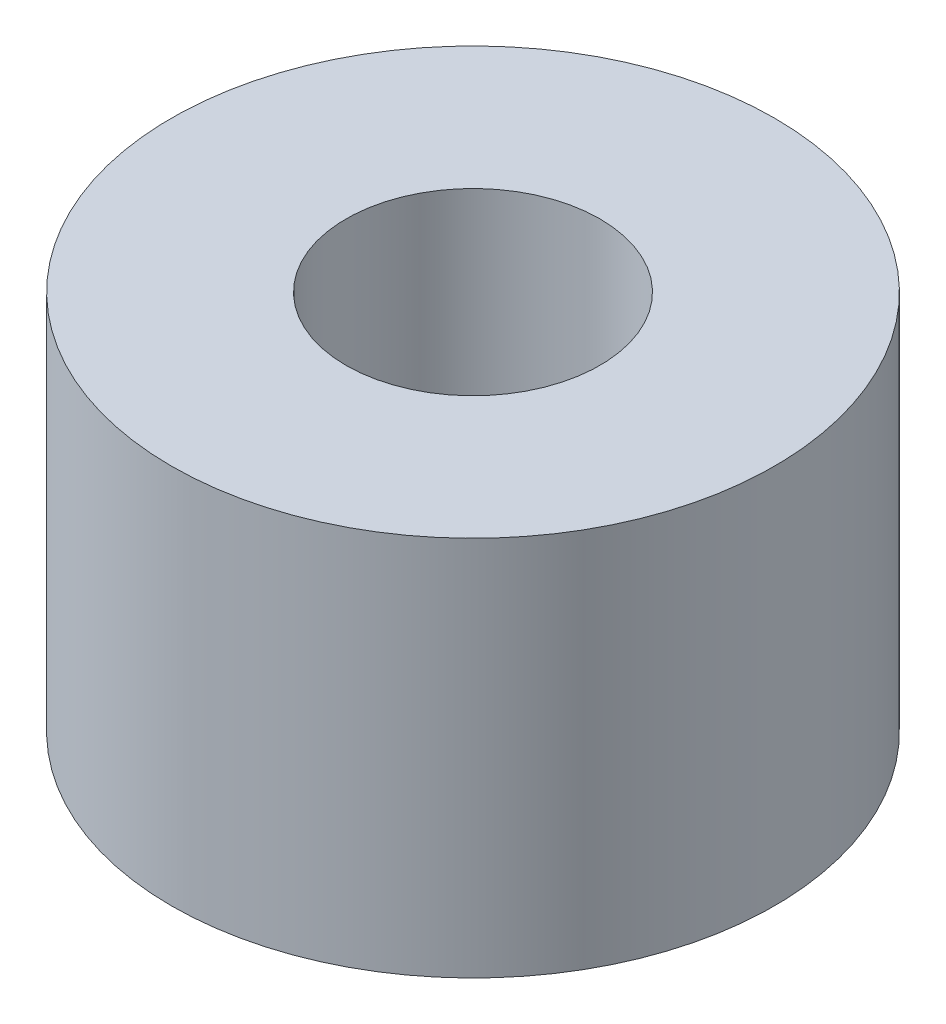
ISO-10303-21;
HEADER;
FILE_DESCRIPTION(('STEP AP214'),'2;1');
FILE_NAME('part.step','',(''),(''),'','','');
FILE_SCHEMA(('AUTOMOTIVE_DESIGN { 1 0 10303 214 1 1 1 1 }'));
ENDSEC;
DATA;
#1=APPLICATION_CONTEXT('core data for automotive mechanical design processes');
#2=APPLICATION_PROTOCOL_DEFINITION('international standard','automotive_design',2000,#1);
#3=PRODUCT_CONTEXT('',#1,'mechanical');
#4=PRODUCT('Part','Part','',(#3));
#5=PRODUCT_RELATED_PRODUCT_CATEGORY('part','',(#4));
#6=PRODUCT_DEFINITION_FORMATION('','',#4);
#7=PRODUCT_DEFINITION_CONTEXT('part definition',#1,'design');
#8=PRODUCT_DEFINITION('design','',#6,#7);
#9=PRODUCT_DEFINITION_SHAPE('','',#8);
#10=(LENGTH_UNIT() NAMED_UNIT(*) SI_UNIT(.MILLI.,.METRE.));
#11=(NAMED_UNIT(*) PLANE_ANGLE_UNIT() SI_UNIT($,.RADIAN.));
#12=(NAMED_UNIT(*) SI_UNIT($,.STERADIAN.) SOLID_ANGLE_UNIT());
#13=UNCERTAINTY_MEASURE_WITH_UNIT(LENGTH_MEASURE(1.E-05),#10,'distance_accuracy_value','');
#14=(GEOMETRIC_REPRESENTATION_CONTEXT(3) GLOBAL_UNCERTAINTY_ASSIGNED_CONTEXT((#13)) GLOBAL_UNIT_ASSIGNED_CONTEXT((#10,
#11,#12)) REPRESENTATION_CONTEXT('',''));
#15=CARTESIAN_POINT('',(0.,0.,0.));
#16=DIRECTION('',(0.,0.,1.));
#17=DIRECTION('',(1.,0.,0.));
#18=AXIS2_PLACEMENT_3D('',#15,#16,#17);
#19=CARTESIAN_POINT('',(0.,12.,0.));
#20=DIRECTION('',(0.,1.,0.));
#21=DIRECTION('',(0.,0.,1.));
#22=AXIS2_PLACEMENT_3D('',#19,#20,#21);
#23=PLANE('',#22);
#24=CARTESIAN_POINT('',(0.,12.,0.));
#25=DIRECTION('',(0.,1.,0.));
#26=DIRECTION('',(0.,0.,1.));
#27=AXIS2_PLACEMENT_3D('',#24,#25,#26);
#28=CIRCLE('',#27,9.5);
#29=CARTESIAN_POINT('',(0.,12.,9.5));
#30=VERTEX_POINT('',#29);
#31=EDGE_CURVE('E10',#30,#30,#28,.T.);
#32=ORIENTED_EDGE('',*,*,#31,.T.);
#33=EDGE_LOOP('',(#32));
#34=FACE_BOUND('',#33,.T.);
#35=CARTESIAN_POINT('',(0.,12.,0.));
#36=DIRECTION('',(0.,1.,0.));
#37=DIRECTION('',(0.,0.,1.));
#38=AXIS2_PLACEMENT_3D('',#35,#36,#37);
#39=CIRCLE('',#38,4.);
#40=CARTESIAN_POINT('',(0.,12.,4.));
#41=VERTEX_POINT('',#40);
#42=EDGE_CURVE('E46',#41,#41,#39,.T.);
#43=ORIENTED_EDGE('',*,*,#42,.F.);
#44=EDGE_LOOP('',(#43));
#45=FACE_BOUND('',#44,.T.);
#46=ADVANCED_FACE('F35',(#34,#45),#23,.T.);
#47=CARTESIAN_POINT('',(0.,0.,0.));
#48=DIRECTION('',(0.,1.,0.));
#49=DIRECTION('',(0.,0.,1.));
#50=AXIS2_PLACEMENT_3D('',#47,#48,#49);
#51=PLANE('',#50);
#52=CARTESIAN_POINT('',(0.,0.,0.));
#53=DIRECTION('',(0.,1.,0.));
#54=DIRECTION('',(0.,0.,1.));
#55=AXIS2_PLACEMENT_3D('',#52,#53,#54);
#56=CIRCLE('',#55,9.5);
#57=CARTESIAN_POINT('',(0.,0.,9.5));
#58=VERTEX_POINT('',#57);
#59=EDGE_CURVE('E39',#58,#58,#56,.T.);
#60=ORIENTED_EDGE('',*,*,#59,.F.);
#61=EDGE_LOOP('',(#60));
#62=FACE_BOUND('',#61,.T.);
#63=CARTESIAN_POINT('',(0.,0.,0.));
#64=DIRECTION('',(0.,1.,0.));
#65=DIRECTION('',(0.,0.,1.));
#66=AXIS2_PLACEMENT_3D('',#63,#64,#65);
#67=CIRCLE('',#66,4.);
#68=CARTESIAN_POINT('',(0.,0.,4.));
#69=VERTEX_POINT('',#68);
#70=EDGE_CURVE('E48',#69,#69,#67,.T.);
#71=ORIENTED_EDGE('',*,*,#70,.T.);
#72=EDGE_LOOP('',(#71));
#73=FACE_BOUND('',#72,.T.);
#74=ADVANCED_FACE('F58',(#62,#73),#51,.F.);
#75=CARTESIAN_POINT('',(0.,12.,0.));
#76=DIRECTION('',(0.,-1.,0.));
#77=DIRECTION('',(0.,0.,-1.));
#78=AXIS2_PLACEMENT_3D('',#75,#76,#77);
#79=CYLINDRICAL_SURFACE('',#78,9.5);
#80=ORIENTED_EDGE('',*,*,#31,.F.);
#81=EDGE_LOOP('',(#80));
#82=FACE_BOUND('',#81,.T.);
#83=ORIENTED_EDGE('',*,*,#59,.T.);
#84=EDGE_LOOP('',(#83));
#85=FACE_BOUND('',#84,.T.);
#86=ADVANCED_FACE('F37',(#82,#85),#79,.T.);
#87=CARTESIAN_POINT('',(0.,12.,0.));
#88=DIRECTION('',(0.,-1.,0.));
#89=DIRECTION('',(0.,0.,-1.));
#90=AXIS2_PLACEMENT_3D('',#87,#88,#89);
#91=CYLINDRICAL_SURFACE('',#90,4.);
#92=ORIENTED_EDGE('',*,*,#42,.T.);
#93=EDGE_LOOP('',(#92));
#94=FACE_BOUND('',#93,.T.);
#95=ORIENTED_EDGE('',*,*,#70,.F.);
#96=EDGE_LOOP('',(#95));
#97=FACE_BOUND('',#96,.T.);
#98=ADVANCED_FACE('F54',(#94,#97),#91,.F.);
#99=CLOSED_SHELL('',(#46,#74,#86,#98));
#100=MANIFOLD_SOLID_BREP('B2',#99);
#101=ADVANCED_BREP_SHAPE_REPRESENTATION('',(#18,#100),#14);
#102=SHAPE_DEFINITION_REPRESENTATION(#9,#101);
ENDSEC;
END-ISO-10303-21;
